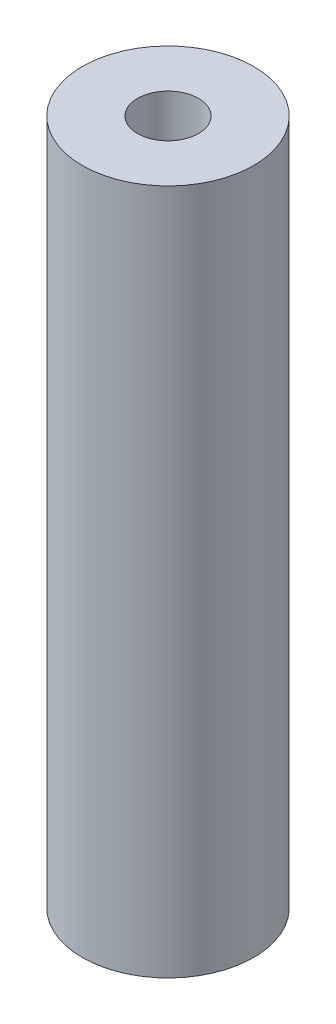
ISO-10303-21;
HEADER;
FILE_DESCRIPTION(('STEP AP214'),'2;1');
FILE_NAME('part.step','',(''),(''),'','','');
FILE_SCHEMA(('AUTOMOTIVE_DESIGN { 1 0 10303 214 1 1 1 1 }'));
ENDSEC;
DATA;
#1=APPLICATION_CONTEXT('core data for automotive mechanical design processes');
#2=APPLICATION_PROTOCOL_DEFINITION('international standard','automotive_design',2000,#1);
#3=PRODUCT_CONTEXT('',#1,'mechanical');
#4=PRODUCT('Part','Part','',(#3));
#5=PRODUCT_RELATED_PRODUCT_CATEGORY('part','',(#4));
#6=PRODUCT_DEFINITION_FORMATION('','',#4);
#7=PRODUCT_DEFINITION_CONTEXT('part definition',#1,'design');
#8=PRODUCT_DEFINITION('design','',#6,#7);
#9=PRODUCT_DEFINITION_SHAPE('','',#8);
#10=(LENGTH_UNIT() NAMED_UNIT(*) SI_UNIT(.MILLI.,.METRE.));
#11=(NAMED_UNIT(*) PLANE_ANGLE_UNIT() SI_UNIT($,.RADIAN.));
#12=(NAMED_UNIT(*) SI_UNIT($,.STERADIAN.) SOLID_ANGLE_UNIT());
#13=UNCERTAINTY_MEASURE_WITH_UNIT(LENGTH_MEASURE(1.E-05),#10,'distance_accuracy_value','');
#14=(GEOMETRIC_REPRESENTATION_CONTEXT(3) GLOBAL_UNCERTAINTY_ASSIGNED_CONTEXT((#13)) GLOBAL_UNIT_ASSIGNED_CONTEXT((#10,
#11,#12)) REPRESENTATION_CONTEXT('',''));
#15=CARTESIAN_POINT('',(0.,0.,0.));
#16=DIRECTION('',(0.,0.,1.));
#17=DIRECTION('',(1.,0.,0.));
#18=AXIS2_PLACEMENT_3D('',#15,#16,#17);
#19=CARTESIAN_POINT('',(0.,18.,0.));
#20=DIRECTION('',(0.,-1.,0.));
#21=DIRECTION('',(0.,0.,-1.));
#22=AXIS2_PLACEMENT_3D('',#19,#20,#21);
#23=CYLINDRICAL_SURFACE('',#22,4.5);
#24=CARTESIAN_POINT('',(0.,18.,0.));
#25=DIRECTION('',(0.,1.,0.));
#26=DIRECTION('',(0.,0.,1.));
#27=AXIS2_PLACEMENT_3D('',#24,#25,#26);
#28=CIRCLE('',#27,4.5);
#29=CARTESIAN_POINT('',(0.,18.,4.5));
#30=VERTEX_POINT('',#29);
#31=EDGE_CURVE('E10',#30,#30,#28,.T.);
#32=ORIENTED_EDGE('',*,*,#31,.F.);
#33=EDGE_LOOP('',(#32));
#34=FACE_BOUND('',#33,.T.);
#35=CARTESIAN_POINT('',(0.,-18.,0.));
#36=DIRECTION('',(0.,1.,0.));
#37=DIRECTION('',(0.,0.,1.));
#38=AXIS2_PLACEMENT_3D('',#35,#36,#37);
#39=CIRCLE('',#38,4.5);
#40=CARTESIAN_POINT('',(0.,-18.,4.5));
#41=VERTEX_POINT('',#40);
#42=EDGE_CURVE('E44',#41,#41,#39,.T.);
#43=ORIENTED_EDGE('',*,*,#42,.T.);
#44=EDGE_LOOP('',(#43));
#45=FACE_BOUND('',#44,.T.);
#46=ADVANCED_FACE('F41',(#34,#45),#23,.T.);
#47=CARTESIAN_POINT('',(0.,18.,0.));
#48=DIRECTION('',(0.,1.,0.));
#49=DIRECTION('',(0.,0.,1.));
#50=AXIS2_PLACEMENT_3D('',#47,#48,#49);
#51=PLANE('',#50);
#52=CARTESIAN_POINT('',(0.,18.,0.));
#53=DIRECTION('',(0.,1.,0.));
#54=DIRECTION('',(0.,0.,1.));
#55=AXIS2_PLACEMENT_3D('',#52,#53,#54);
#56=CIRCLE('',#55,1.59999999999999);
#57=CARTESIAN_POINT('',(0.,18.,1.59999999999999));
#58=VERTEX_POINT('',#57);
#59=EDGE_CURVE('E58',#58,#58,#56,.T.);
#60=ORIENTED_EDGE('',*,*,#59,.F.);
#61=EDGE_LOOP('',(#60));
#62=FACE_BOUND('',#61,.T.);
#63=ORIENTED_EDGE('',*,*,#31,.T.);
#64=EDGE_LOOP('',(#63));
#65=FACE_BOUND('',#64,.T.);
#66=ADVANCED_FACE('F65',(#62,#65),#51,.T.);
#67=CARTESIAN_POINT('',(0.,-18.,0.));
#68=DIRECTION('',(0.,1.,0.));
#69=DIRECTION('',(0.,0.,1.));
#70=AXIS2_PLACEMENT_3D('',#67,#68,#69);
#71=PLANE('',#70);
#72=CARTESIAN_POINT('',(0.,-18.,0.));
#73=DIRECTION('',(0.,1.,0.));
#74=DIRECTION('',(0.,0.,1.));
#75=AXIS2_PLACEMENT_3D('',#72,#73,#74);
#76=CIRCLE('',#75,1.59999999999999);
#77=CARTESIAN_POINT('',(0.,-18.,1.59999999999999));
#78=VERTEX_POINT('',#77);
#79=EDGE_CURVE('E53',#78,#78,#76,.T.);
#80=ORIENTED_EDGE('',*,*,#79,.T.);
#81=EDGE_LOOP('',(#80));
#82=FACE_BOUND('',#81,.T.);
#83=ORIENTED_EDGE('',*,*,#42,.F.);
#84=EDGE_LOOP('',(#83));
#85=FACE_BOUND('',#84,.T.);
#86=ADVANCED_FACE('F67',(#82,#85),#71,.F.);
#87=CARTESIAN_POINT('',(0.,18.,0.));
#88=DIRECTION('',(0.,1.,0.));
#89=DIRECTION('',(0.,0.,1.));
#90=AXIS2_PLACEMENT_3D('',#87,#88,#89);
#91=CYLINDRICAL_SURFACE('',#90,1.59999999999999);
#92=ORIENTED_EDGE('',*,*,#79,.F.);
#93=EDGE_LOOP('',(#92));
#94=FACE_BOUND('',#93,.T.);
#95=ORIENTED_EDGE('',*,*,#59,.T.);
#96=EDGE_LOOP('',(#95));
#97=FACE_BOUND('',#96,.T.);
#98=ADVANCED_FACE('F63',(#94,#97),#91,.F.);
#99=CLOSED_SHELL('',(#46,#66,#86,#98));
#100=MANIFOLD_SOLID_BREP('B2',#99);
#101=ADVANCED_BREP_SHAPE_REPRESENTATION('',(#18,#100),#14);
#102=SHAPE_DEFINITION_REPRESENTATION(#9,#101);
ENDSEC;
END-ISO-10303-21;
